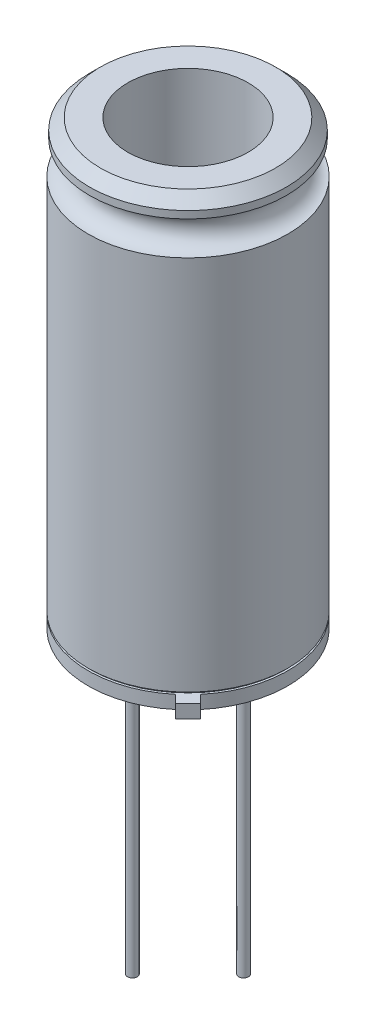
ISO-10303-21;
HEADER;
FILE_DESCRIPTION(('STEP AP214'),'2;1');
FILE_NAME('part.step','',(''),(''),'','','');
FILE_SCHEMA(('AUTOMOTIVE_DESIGN { 1 0 10303 214 1 1 1 1 }'));
ENDSEC;
DATA;
#1=APPLICATION_CONTEXT('core data for automotive mechanical design processes');
#2=APPLICATION_PROTOCOL_DEFINITION('international standard','automotive_design',2000,#1);
#3=PRODUCT_CONTEXT('',#1,'mechanical');
#4=PRODUCT('Part','Part','',(#3));
#5=PRODUCT_RELATED_PRODUCT_CATEGORY('part','',(#4));
#6=PRODUCT_DEFINITION_FORMATION('','',#4);
#7=PRODUCT_DEFINITION_CONTEXT('part definition',#1,'design');
#8=PRODUCT_DEFINITION('design','',#6,#7);
#9=PRODUCT_DEFINITION_SHAPE('','',#8);
#10=(LENGTH_UNIT() NAMED_UNIT(*) SI_UNIT(.MILLI.,.METRE.));
#11=(NAMED_UNIT(*) PLANE_ANGLE_UNIT() SI_UNIT($,.RADIAN.));
#12=(NAMED_UNIT(*) SI_UNIT($,.STERADIAN.) SOLID_ANGLE_UNIT());
#13=UNCERTAINTY_MEASURE_WITH_UNIT(LENGTH_MEASURE(1.E-05),#10,'distance_accuracy_value','');
#14=(GEOMETRIC_REPRESENTATION_CONTEXT(3) GLOBAL_UNCERTAINTY_ASSIGNED_CONTEXT((#13)) GLOBAL_UNIT_ASSIGNED_CONTEXT((#10,
#11,#12)) REPRESENTATION_CONTEXT('',''));
#15=CARTESIAN_POINT('',(0.,0.,0.));
#16=DIRECTION('',(0.,0.,1.));
#17=DIRECTION('',(1.,0.,0.));
#18=AXIS2_PLACEMENT_3D('',#15,#16,#17);
#19=CARTESIAN_POINT('',(-4.46,0.,0.));
#20=DIRECTION('',(0.,1.,0.));
#21=DIRECTION('',(-1.,0.,0.));
#22=AXIS2_PLACEMENT_3D('',#19,#20,#21);
#23=PLANE('',#22);
#24=CARTESIAN_POINT('',(0.,0.,0.));
#25=DIRECTION('',(0.,1.,0.));
#26=DIRECTION('',(-1.,0.,0.));
#27=AXIS2_PLACEMENT_3D('',#24,#25,#26);
#28=CIRCLE('',#27,4.46);
#29=CARTESIAN_POINT('',(-4.46,0.,0.));
#30=VERTEX_POINT('',#29);
#31=EDGE_CURVE('E121',#30,#30,#28,.T.);
#32=ORIENTED_EDGE('',*,*,#31,.T.);
#33=EDGE_LOOP('',(#32));
#34=FACE_BOUND('',#33,.T.);
#35=ADVANCED_FACE('F43',(#34),#23,.T.);
#36=CARTESIAN_POINT('',(0.,-0.699999999999999,0.));
#37=DIRECTION('',(0.,-1.,0.));
#38=DIRECTION('',(1.,0.,0.));
#39=AXIS2_PLACEMENT_3D('',#36,#37,#38);
#40=PLANE('',#39);
#41=CARTESIAN_POINT('',(0.,-0.699999999999999,2.54));
#42=DIRECTION('',(0.,-1.,0.));
#43=DIRECTION('',(1.,0.,0.));
#44=AXIS2_PLACEMENT_3D('',#41,#42,#43);
#45=CIRCLE('',#44,0.225);
#46=CARTESIAN_POINT('',(0.225,-0.699999999999999,2.54));
#47=VERTEX_POINT('',#46);
#48=EDGE_CURVE('E132',#47,#47,#45,.F.);
#49=ORIENTED_EDGE('',*,*,#48,.T.);
#50=EDGE_LOOP('',(#49));
#51=FACE_BOUND('',#50,.T.);
#52=CARTESIAN_POINT('',(-2.54,-0.699999999999999,0.));
#53=DIRECTION('',(0.,-1.,0.));
#54=DIRECTION('',(1.,0.,0.));
#55=AXIS2_PLACEMENT_3D('',#52,#53,#54);
#56=CIRCLE('',#55,0.8);
#57=CARTESIAN_POINT('',(-1.74,-0.699999999999999,0.));
#58=VERTEX_POINT('',#57);
#59=EDGE_CURVE('E135',#58,#58,#56,.T.);
#60=ORIENTED_EDGE('',*,*,#59,.F.);
#61=EDGE_LOOP('',(#60));
#62=FACE_BOUND('',#61,.T.);
#63=CARTESIAN_POINT('',(0.,-0.699999999999999,-2.54));
#64=DIRECTION('',(0.,-1.,0.));
#65=DIRECTION('',(1.,0.,0.));
#66=AXIS2_PLACEMENT_3D('',#63,#64,#65);
#67=CIRCLE('',#66,0.8);
#68=CARTESIAN_POINT('',(0.8,-0.699999999999999,-2.54));
#69=VERTEX_POINT('',#68);
#70=EDGE_CURVE('E153',#69,#69,#67,.T.);
#71=ORIENTED_EDGE('',*,*,#70,.F.);
#72=EDGE_LOOP('',(#71));
#73=FACE_BOUND('',#72,.T.);
#74=CARTESIAN_POINT('',(2.54,-0.699999999999999,0.));
#75=DIRECTION('',(0.,-1.,0.));
#76=DIRECTION('',(1.,0.,0.));
#77=AXIS2_PLACEMENT_3D('',#74,#75,#76);
#78=CIRCLE('',#77,0.8);
#79=CARTESIAN_POINT('',(3.34,-0.699999999999999,0.));
#80=VERTEX_POINT('',#79);
#81=EDGE_CURVE('E109',#80,#80,#78,.T.);
#82=ORIENTED_EDGE('',*,*,#81,.F.);
#83=EDGE_LOOP('',(#82));
#84=FACE_BOUND('',#83,.T.);
#85=DIRECTION('',(-0.707106781186546,0.,-0.707106781186549));
#86=VECTOR('',#85,1.);
#87=CARTESIAN_POINT('',(-0.282842712474619,-0.699999999999999,0.282842712474618));
#88=LINE('',#87,#86);
#89=CARTESIAN_POINT('',(3.2951176003293,-0.699999999999999,3.86080302527856));
#90=VERTEX_POINT('',#89);
#91=CARTESIAN_POINT('',(2.92913487150693,-0.699999999999999,3.49482029645618));
#92=VERTEX_POINT('',#91);
#93=EDGE_CURVE('E90',#90,#92,#88,.T.);
#94=ORIENTED_EDGE('',*,*,#93,.T.);
#95=CARTESIAN_POINT('',(0.,-0.699999999999999,0.));
#96=DIRECTION('',(0.,1.,0.));
#97=DIRECTION('',(-1.,0.,0.));
#98=AXIS2_PLACEMENT_3D('',#95,#96,#97);
#99=CIRCLE('',#98,4.56);
#100=CARTESIAN_POINT('',(3.49482029645617,-0.699999999999999,2.92913487150694));
#101=VERTEX_POINT('',#100);
#102=EDGE_CURVE('E61',#101,#92,#99,.T.);
#103=ORIENTED_EDGE('',*,*,#102,.F.);
#104=DIRECTION('',(0.707106781186546,0.,0.707106781186549));
#105=VECTOR('',#104,1.);
#106=CARTESIAN_POINT('',(0.28284271247462,-0.699999999999999,-0.282842712474618));
#107=LINE('',#106,#105);
#108=CARTESIAN_POINT('',(3.86080302527854,-0.699999999999999,3.29511760032932));
#109=VERTEX_POINT('',#108);
#110=EDGE_CURVE('E81',#101,#109,#107,.T.);
#111=ORIENTED_EDGE('',*,*,#110,.T.);
#112=DIRECTION('',(-0.70710678118655,0.,0.707106781186545));
#113=VECTOR('',#112,1.);
#114=CARTESIAN_POINT('',(3.86080302527854,-0.699999999999999,3.29511760032932));
#115=LINE('',#114,#113);
#116=EDGE_CURVE('E86',#109,#90,#115,.T.);
#117=ORIENTED_EDGE('',*,*,#116,.T.);
#118=EDGE_LOOP('',(#94,#103,#111,#117));
#119=FACE_BOUND('',#118,.T.);
#120=ADVANCED_FACE('F84',(#51,#62,#73,#84,#119),#40,.T.);
#121=CARTESIAN_POINT('',(0.,0.,0.));
#122=DIRECTION('',(0.,1.,0.));
#123=DIRECTION('',(-1.,0.,0.));
#124=AXIS2_PLACEMENT_3D('',#121,#122,#123);
#125=CYLINDRICAL_SURFACE('',#124,4.56);
#126=DIRECTION('',(0.,1.,0.));
#127=VECTOR('',#126,1.);
#128=CARTESIAN_POINT('',(2.92913487150693,0.,3.49482029645618));
#129=LINE('',#128,#127);
#130=CARTESIAN_POINT('',(2.92913487150693,-0.0999999999999991,3.49482029645618));
#131=VERTEX_POINT('',#130);
#132=EDGE_CURVE('E119',#131,#92,#129,.F.);
#133=ORIENTED_EDGE('',*,*,#132,.F.);
#134=CARTESIAN_POINT('',(0.,-0.0999999999999995,0.));
#135=DIRECTION('',(0.,1.,0.));
#136=DIRECTION('',(-1.,0.,0.));
#137=AXIS2_PLACEMENT_3D('',#134,#135,#136);
#138=CIRCLE('',#137,4.56);
#139=CARTESIAN_POINT('',(3.49482029645617,-0.099999999999999,2.92913487150694));
#140=VERTEX_POINT('',#139);
#141=EDGE_CURVE('E127',#140,#131,#138,.T.);
#142=ORIENTED_EDGE('',*,*,#141,.F.);
#143=DIRECTION('',(0.,1.,0.));
#144=VECTOR('',#143,1.);
#145=CARTESIAN_POINT('',(3.49482029645617,0.,2.92913487150694));
#146=LINE('',#145,#144);
#147=EDGE_CURVE('E57',#101,#140,#146,.T.);
#148=ORIENTED_EDGE('',*,*,#147,.F.);
#149=ORIENTED_EDGE('',*,*,#102,.T.);
#150=EDGE_LOOP('',(#133,#142,#148,#149));
#151=FACE_BOUND('',#150,.T.);
#152=ADVANCED_FACE('F207',(#151),#125,.T.);
#153=CARTESIAN_POINT('',(-4.56,-0.1,0.));
#154=DIRECTION('',(0.,1.,0.));
#155=DIRECTION('',(-1.,0.,0.));
#156=AXIS2_PLACEMENT_3D('',#153,#154,#155);
#157=PLANE('',#156);
#158=ORIENTED_EDGE('',*,*,#141,.T.);
#159=DIRECTION('',(-0.707106781186546,0.,-0.707106781186549));
#160=VECTOR('',#159,1.);
#161=CARTESIAN_POINT('',(-0.28284271247462,-0.0999999999999994,0.282842712474618));
#162=LINE('',#161,#160);
#163=CARTESIAN_POINT('',(3.2951176003293,-0.099999999999999,3.86080302527856));
#164=VERTEX_POINT('',#163);
#165=EDGE_CURVE('E89',#164,#131,#162,.T.);
#166=ORIENTED_EDGE('',*,*,#165,.F.);
#167=DIRECTION('',(-0.70710678118655,0.,0.707106781186545));
#168=VECTOR('',#167,1.);
#169=CARTESIAN_POINT('',(3.86080302527854,-0.0999999999999994,3.29511760032932));
#170=LINE('',#169,#168);
#171=CARTESIAN_POINT('',(3.86080302527854,-0.099999999999999,3.29511760032932));
#172=VERTEX_POINT('',#171);
#173=EDGE_CURVE('E100',#172,#164,#170,.T.);
#174=ORIENTED_EDGE('',*,*,#173,.F.);
#175=DIRECTION('',(0.707106781186546,0.,0.707106781186549));
#176=VECTOR('',#175,1.);
#177=CARTESIAN_POINT('',(0.28284271247462,-0.0999999999999994,-0.282842712474618));
#178=LINE('',#177,#176);
#179=EDGE_CURVE('E96',#140,#172,#178,.T.);
#180=ORIENTED_EDGE('',*,*,#179,.F.);
#181=EDGE_LOOP('',(#158,#166,#174,#180));
#182=FACE_BOUND('',#181,.T.);
#183=CARTESIAN_POINT('',(0.,-0.0999999999999995,0.));
#184=DIRECTION('',(0.,1.,0.));
#185=DIRECTION('',(-1.,0.,0.));
#186=AXIS2_PLACEMENT_3D('',#183,#184,#185);
#187=CIRCLE('',#186,4.46);
#188=CARTESIAN_POINT('',(-4.46,-0.1,0.));
#189=VERTEX_POINT('',#188);
#190=EDGE_CURVE('E124',#189,#189,#187,.T.);
#191=ORIENTED_EDGE('',*,*,#190,.F.);
#192=EDGE_LOOP('',(#191));
#193=FACE_BOUND('',#192,.T.);
#194=ADVANCED_FACE('F214',(#182,#193),#157,.T.);
#195=CARTESIAN_POINT('',(0.,0.,0.));
#196=DIRECTION('',(0.,1.,0.));
#197=DIRECTION('',(-1.,0.,0.));
#198=AXIS2_PLACEMENT_3D('',#195,#196,#197);
#199=CYLINDRICAL_SURFACE('',#198,4.46);
#200=ORIENTED_EDGE('',*,*,#190,.T.);
#201=EDGE_LOOP('',(#200));
#202=FACE_BOUND('',#201,.T.);
#203=ORIENTED_EDGE('',*,*,#31,.F.);
#204=EDGE_LOOP('',(#203));
#205=FACE_BOUND('',#204,.T.);
#206=ADVANCED_FACE('F211',(#202,#205),#199,.T.);
#207=CARTESIAN_POINT('',(-0.28284271247462,5.76,0.282842712474618));
#208=DIRECTION('',(-0.707106781186549,0.,0.707106781186546));
#209=DIRECTION('',(0.707106781186546,0.,0.707106781186549));
#210=AXIS2_PLACEMENT_3D('',#207,#208,#209);
#211=PLANE('',#210);
#212=ORIENTED_EDGE('',*,*,#165,.T.);
#213=ORIENTED_EDGE('',*,*,#132,.T.);
#214=ORIENTED_EDGE('',*,*,#93,.F.);
#215=DIRECTION('',(0.,-1.,0.));
#216=VECTOR('',#215,1.);
#217=CARTESIAN_POINT('',(3.2951176003293,5.76,3.86080302527856));
#218=LINE('',#217,#216);
#219=EDGE_CURVE('E104',#164,#90,#218,.T.);
#220=ORIENTED_EDGE('',*,*,#219,.F.);
#221=EDGE_LOOP('',(#212,#213,#214,#220));
#222=FACE_BOUND('',#221,.T.);
#223=ADVANCED_FACE('F213',(#222),#211,.T.);
#224=CARTESIAN_POINT('',(0.282842712474619,5.76,-0.282842712474618));
#225=DIRECTION('',(0.707106781186549,0.,-0.707106781186546));
#226=DIRECTION('',(-0.707106781186546,0.,-0.707106781186549));
#227=AXIS2_PLACEMENT_3D('',#224,#225,#226);
#228=PLANE('',#227);
#229=ORIENTED_EDGE('',*,*,#110,.F.);
#230=ORIENTED_EDGE('',*,*,#147,.T.);
#231=ORIENTED_EDGE('',*,*,#179,.T.);
#232=DIRECTION('',(0.,-1.,0.));
#233=VECTOR('',#232,1.);
#234=CARTESIAN_POINT('',(3.86080302527854,5.76,3.29511760032932));
#235=LINE('',#234,#233);
#236=EDGE_CURVE('E93',#172,#109,#235,.T.);
#237=ORIENTED_EDGE('',*,*,#236,.T.);
#238=EDGE_LOOP('',(#229,#230,#231,#237));
#239=FACE_BOUND('',#238,.T.);
#240=ADVANCED_FACE('F94',(#239),#228,.T.);
#241=CARTESIAN_POINT('',(3.86080302527854,5.76,3.29511760032932));
#242=DIRECTION('',(0.707106781186545,0.,0.70710678118655));
#243=DIRECTION('',(0.70710678118655,0.,-0.707106781186545));
#244=AXIS2_PLACEMENT_3D('',#241,#242,#243);
#245=PLANE('',#244);
#246=ORIENTED_EDGE('',*,*,#236,.F.);
#247=ORIENTED_EDGE('',*,*,#173,.T.);
#248=ORIENTED_EDGE('',*,*,#219,.T.);
#249=ORIENTED_EDGE('',*,*,#116,.F.);
#250=EDGE_LOOP('',(#246,#247,#248,#249));
#251=FACE_BOUND('',#250,.T.);
#252=ADVANCED_FACE('F102',(#251),#245,.T.);
#253=CARTESIAN_POINT('',(-4.56,-0.1,0.));
#254=DIRECTION('',(0.,1.,0.));
#255=DIRECTION('',(-1.,0.,0.));
#256=AXIS2_PLACEMENT_3D('',#253,#254,#255);
#257=PLANE('',#256);
#258=CARTESIAN_POINT('',(2.54,-0.0999999999999977,0.));
#259=DIRECTION('',(0.,1.,0.));
#260=DIRECTION('',(-1.,0.,0.));
#261=AXIS2_PLACEMENT_3D('',#258,#259,#260);
#262=CIRCLE('',#261,0.225);
#263=CARTESIAN_POINT('',(2.315,-0.0999999999999977,0.));
#264=VERTEX_POINT('',#263);
#265=EDGE_CURVE('E131',#264,#264,#262,.F.);
#266=ORIENTED_EDGE('',*,*,#265,.F.);
#267=EDGE_LOOP('',(#266));
#268=FACE_BOUND('',#267,.T.);
#269=CARTESIAN_POINT('',(2.54,-0.099999999999999,0.));
#270=DIRECTION('',(0.,1.,0.));
#271=DIRECTION('',(-1.,0.,0.));
#272=AXIS2_PLACEMENT_3D('',#269,#270,#271);
#273=CIRCLE('',#272,0.8);
#274=CARTESIAN_POINT('',(1.74,-0.0999999999999991,0.));
#275=VERTEX_POINT('',#274);
#276=EDGE_CURVE('E105',#275,#275,#273,.F.);
#277=ORIENTED_EDGE('',*,*,#276,.T.);
#278=EDGE_LOOP('',(#277));
#279=FACE_BOUND('',#278,.T.);
#280=ADVANCED_FACE('F267',(#268,#279),#257,.F.);
#281=CARTESIAN_POINT('',(2.54,2.16274169979695,0.));
#282=DIRECTION('',(0.,-1.,0.));
#283=DIRECTION('',(1.,0.,0.));
#284=AXIS2_PLACEMENT_3D('',#281,#282,#283);
#285=CYLINDRICAL_SURFACE('',#284,0.8);
#286=ORIENTED_EDGE('',*,*,#81,.T.);
#287=EDGE_LOOP('',(#286));
#288=FACE_BOUND('',#287,.T.);
#289=ORIENTED_EDGE('',*,*,#276,.F.);
#290=EDGE_LOOP('',(#289));
#291=FACE_BOUND('',#290,.T.);
#292=ADVANCED_FACE('F147',(#288,#291),#285,.F.);
#293=CARTESIAN_POINT('',(-4.56,-0.1,0.));
#294=DIRECTION('',(0.,1.,0.));
#295=DIRECTION('',(-1.,0.,0.));
#296=AXIS2_PLACEMENT_3D('',#293,#294,#295);
#297=PLANE('',#296);
#298=CARTESIAN_POINT('',(0.,-0.0999999999999994,-2.54));
#299=DIRECTION('',(0.,1.,0.));
#300=DIRECTION('',(-1.,0.,0.));
#301=AXIS2_PLACEMENT_3D('',#298,#299,#300);
#302=CIRCLE('',#301,0.225);
#303=CARTESIAN_POINT('',(-0.225,-0.0999999999999994,-2.54));
#304=VERTEX_POINT('',#303);
#305=EDGE_CURVE('E50',#304,#304,#302,.F.);
#306=ORIENTED_EDGE('',*,*,#305,.F.);
#307=EDGE_LOOP('',(#306));
#308=FACE_BOUND('',#307,.T.);
#309=CARTESIAN_POINT('',(0.,-0.0999999999999994,-2.54));
#310=DIRECTION('',(0.,1.,0.));
#311=DIRECTION('',(-1.,0.,0.));
#312=AXIS2_PLACEMENT_3D('',#309,#310,#311);
#313=CIRCLE('',#312,0.8);
#314=CARTESIAN_POINT('',(-0.8,-0.0999999999999995,-2.54));
#315=VERTEX_POINT('',#314);
#316=EDGE_CURVE('E151',#315,#315,#313,.F.);
#317=ORIENTED_EDGE('',*,*,#316,.T.);
#318=EDGE_LOOP('',(#317));
#319=FACE_BOUND('',#318,.T.);
#320=ADVANCED_FACE('F143',(#308,#319),#297,.F.);
#321=CARTESIAN_POINT('',(0.,2.16274169979695,-2.54));
#322=DIRECTION('',(0.,-1.,0.));
#323=DIRECTION('',(1.,0.,0.));
#324=AXIS2_PLACEMENT_3D('',#321,#322,#323);
#325=CYLINDRICAL_SURFACE('',#324,0.8);
#326=ORIENTED_EDGE('',*,*,#70,.T.);
#327=EDGE_LOOP('',(#326));
#328=FACE_BOUND('',#327,.T.);
#329=ORIENTED_EDGE('',*,*,#316,.F.);
#330=EDGE_LOOP('',(#329));
#331=FACE_BOUND('',#330,.T.);
#332=ADVANCED_FACE('F146',(#328,#331),#325,.F.);
#333=CARTESIAN_POINT('',(-4.56,-0.1,0.));
#334=DIRECTION('',(0.,1.,0.));
#335=DIRECTION('',(-1.,0.,0.));
#336=AXIS2_PLACEMENT_3D('',#333,#334,#335);
#337=PLANE('',#336);
#338=CARTESIAN_POINT('',(-2.54,-0.0999999999999994,0.));
#339=DIRECTION('',(0.,1.,0.));
#340=DIRECTION('',(-1.,0.,0.));
#341=AXIS2_PLACEMENT_3D('',#338,#339,#340);
#342=CIRCLE('',#341,0.225);
#343=CARTESIAN_POINT('',(-2.765,-0.0999999999999994,0.));
#344=VERTEX_POINT('',#343);
#345=EDGE_CURVE('E12',#344,#344,#342,.F.);
#346=ORIENTED_EDGE('',*,*,#345,.F.);
#347=EDGE_LOOP('',(#346));
#348=FACE_BOUND('',#347,.T.);
#349=CARTESIAN_POINT('',(-2.54,-0.0999999999999994,0.));
#350=DIRECTION('',(0.,1.,0.));
#351=DIRECTION('',(-1.,0.,0.));
#352=AXIS2_PLACEMENT_3D('',#349,#350,#351);
#353=CIRCLE('',#352,0.8);
#354=CARTESIAN_POINT('',(-3.34,-0.0999999999999995,0.));
#355=VERTEX_POINT('',#354);
#356=EDGE_CURVE('E157',#355,#355,#353,.F.);
#357=ORIENTED_EDGE('',*,*,#356,.T.);
#358=EDGE_LOOP('',(#357));
#359=FACE_BOUND('',#358,.T.);
#360=ADVANCED_FACE('F185',(#348,#359),#337,.F.);
#361=CARTESIAN_POINT('',(-2.54,2.16274169979695,0.));
#362=DIRECTION('',(0.,-1.,0.));
#363=DIRECTION('',(1.,0.,0.));
#364=AXIS2_PLACEMENT_3D('',#361,#362,#363);
#365=CYLINDRICAL_SURFACE('',#364,0.8);
#366=ORIENTED_EDGE('',*,*,#59,.T.);
#367=EDGE_LOOP('',(#366));
#368=FACE_BOUND('',#367,.T.);
#369=ORIENTED_EDGE('',*,*,#356,.F.);
#370=EDGE_LOOP('',(#369));
#371=FACE_BOUND('',#370,.T.);
#372=ADVANCED_FACE('F188',(#368,#371),#365,.F.);
#373=CARTESIAN_POINT('',(0.,-13.1,2.54));
#374=DIRECTION('',(0.,1.,0.));
#375=DIRECTION('',(-1.,0.,0.));
#376=AXIS2_PLACEMENT_3D('',#373,#374,#375);
#377=CYLINDRICAL_SURFACE('',#376,0.225);
#378=ORIENTED_EDGE('',*,*,#48,.F.);
#379=EDGE_LOOP('',(#378));
#380=FACE_BOUND('',#379,.T.);
#381=CARTESIAN_POINT('',(0.,-13.1,2.54));
#382=DIRECTION('',(0.,-1.,0.));
#383=DIRECTION('',(1.,0.,0.));
#384=AXIS2_PLACEMENT_3D('',#381,#382,#383);
#385=CIRCLE('',#384,0.225);
#386=CARTESIAN_POINT('',(0.225000000000002,-13.1,2.54));
#387=VERTEX_POINT('',#386);
#388=EDGE_CURVE('E136',#387,#387,#385,.T.);
#389=ORIENTED_EDGE('',*,*,#388,.F.);
#390=EDGE_LOOP('',(#389));
#391=FACE_BOUND('',#390,.T.);
#392=ADVANCED_FACE('F193',(#380,#391),#377,.T.);
#393=CARTESIAN_POINT('',(0.,-13.1,2.54));
#394=DIRECTION('',(0.,-1.,0.));
#395=DIRECTION('',(1.,0.,0.));
#396=AXIS2_PLACEMENT_3D('',#393,#394,#395);
#397=PLANE('',#396);
#398=ORIENTED_EDGE('',*,*,#388,.T.);
#399=EDGE_LOOP('',(#398));
#400=FACE_BOUND('',#399,.T.);
#401=ADVANCED_FACE('F199',(#400),#397,.T.);
#402=CARTESIAN_POINT('',(2.54,-13.1,0.));
#403=DIRECTION('',(0.,1.,0.));
#404=DIRECTION('',(-1.,0.,0.));
#405=AXIS2_PLACEMENT_3D('',#402,#403,#404);
#406=CYLINDRICAL_SURFACE('',#405,0.225);
#407=CARTESIAN_POINT('',(2.54,-13.1,0.));
#408=DIRECTION('',(0.,-1.,0.));
#409=DIRECTION('',(1.,0.,0.));
#410=AXIS2_PLACEMENT_3D('',#407,#408,#409);
#411=CIRCLE('',#410,0.225);
#412=CARTESIAN_POINT('',(2.765,-13.1,0.));
#413=VERTEX_POINT('',#412);
#414=EDGE_CURVE('E166',#413,#413,#411,.T.);
#415=ORIENTED_EDGE('',*,*,#414,.F.);
#416=EDGE_LOOP('',(#415));
#417=FACE_BOUND('',#416,.T.);
#418=ORIENTED_EDGE('',*,*,#265,.T.);
#419=EDGE_LOOP('',(#418));
#420=FACE_BOUND('',#419,.T.);
#421=ADVANCED_FACE('F329',(#417,#420),#406,.T.);
#422=CARTESIAN_POINT('',(2.54,-13.1,0.));
#423=DIRECTION('',(0.,-1.,0.));
#424=DIRECTION('',(1.,0.,0.));
#425=AXIS2_PLACEMENT_3D('',#422,#423,#424);
#426=PLANE('',#425);
#427=ORIENTED_EDGE('',*,*,#414,.T.);
#428=EDGE_LOOP('',(#427));
#429=FACE_BOUND('',#428,.T.);
#430=ADVANCED_FACE('F339',(#429),#426,.T.);
#431=CARTESIAN_POINT('',(0.,-13.1,-2.54));
#432=DIRECTION('',(0.,1.,0.));
#433=DIRECTION('',(-1.,0.,0.));
#434=AXIS2_PLACEMENT_3D('',#431,#432,#433);
#435=CYLINDRICAL_SURFACE('',#434,0.225);
#436=CARTESIAN_POINT('',(0.,-13.1,-2.54));
#437=DIRECTION('',(0.,-1.,0.));
#438=DIRECTION('',(1.,0.,0.));
#439=AXIS2_PLACEMENT_3D('',#436,#437,#438);
#440=CIRCLE('',#439,0.225);
#441=CARTESIAN_POINT('',(0.225000000000002,-13.1,-2.54));
#442=VERTEX_POINT('',#441);
#443=EDGE_CURVE('E169',#442,#442,#440,.T.);
#444=ORIENTED_EDGE('',*,*,#443,.F.);
#445=EDGE_LOOP('',(#444));
#446=FACE_BOUND('',#445,.T.);
#447=ORIENTED_EDGE('',*,*,#305,.T.);
#448=EDGE_LOOP('',(#447));
#449=FACE_BOUND('',#448,.T.);
#450=ADVANCED_FACE('F141',(#446,#449),#435,.T.);
#451=CARTESIAN_POINT('',(0.,-13.1,-2.54));
#452=DIRECTION('',(0.,-1.,0.));
#453=DIRECTION('',(1.,0.,0.));
#454=AXIS2_PLACEMENT_3D('',#451,#452,#453);
#455=PLANE('',#454);
#456=ORIENTED_EDGE('',*,*,#443,.T.);
#457=EDGE_LOOP('',(#456));
#458=FACE_BOUND('',#457,.T.);
#459=ADVANCED_FACE('F181',(#458),#455,.T.);
#460=CARTESIAN_POINT('',(-2.54,-13.1,0.));
#461=DIRECTION('',(0.,1.,0.));
#462=DIRECTION('',(-1.,0.,0.));
#463=AXIS2_PLACEMENT_3D('',#460,#461,#462);
#464=CYLINDRICAL_SURFACE('',#463,0.225);
#465=CARTESIAN_POINT('',(-2.54,-13.1,0.));
#466=DIRECTION('',(0.,-1.,0.));
#467=DIRECTION('',(1.,0.,0.));
#468=AXIS2_PLACEMENT_3D('',#465,#466,#467);
#469=CIRCLE('',#468,0.225);
#470=CARTESIAN_POINT('',(-2.315,-13.1,0.));
#471=VERTEX_POINT('',#470);
#472=EDGE_CURVE('E172',#471,#471,#469,.T.);
#473=ORIENTED_EDGE('',*,*,#472,.F.);
#474=EDGE_LOOP('',(#473));
#475=FACE_BOUND('',#474,.T.);
#476=ORIENTED_EDGE('',*,*,#345,.T.);
#477=EDGE_LOOP('',(#476));
#478=FACE_BOUND('',#477,.T.);
#479=ADVANCED_FACE('F178',(#475,#478),#464,.T.);
#480=CARTESIAN_POINT('',(-2.54,-13.1,0.));
#481=DIRECTION('',(0.,-1.,0.));
#482=DIRECTION('',(1.,0.,0.));
#483=AXIS2_PLACEMENT_3D('',#480,#481,#482);
#484=PLANE('',#483);
#485=ORIENTED_EDGE('',*,*,#472,.T.);
#486=EDGE_LOOP('',(#485));
#487=FACE_BOUND('',#486,.T.);
#488=ADVANCED_FACE('F176',(#487),#484,.T.);
#489=CLOSED_SHELL('',(#35,#120,#152,#194,#206,#223,#240,#252,#280,#292,#320,#332,#360,#372,#392,
#401,#421,#430,#450,#459,#479,#488));
#490=MANIFOLD_SOLID_BREP('B2',#489);
#491=CARTESIAN_POINT('',(0.,17.92,0.));
#492=DIRECTION('',(0.,1.,0.));
#493=DIRECTION('',(0.,0.,1.));
#494=AXIS2_PLACEMENT_3D('',#491,#492,#493);
#495=TOROIDAL_SURFACE('',#494,4.56,0.75);
#496=CARTESIAN_POINT('',(0.,18.6675961476626,0.));
#497=DIRECTION('',(0.,-1.,0.));
#498=DIRECTION('',(0.,0.,-1.));
#499=AXIS2_PLACEMENT_3D('',#496,#497,#498);
#500=CIRCLE('',#499,4.5);
#501=CARTESIAN_POINT('',(0.,18.6675961476626,-4.5));
#502=VERTEX_POINT('',#501);
#503=EDGE_CURVE('E434',#502,#502,#500,.T.);
#504=ORIENTED_EDGE('',*,*,#503,.T.);
#505=EDGE_LOOP('',(#504));
#506=FACE_BOUND('',#505,.T.);
#507=CARTESIAN_POINT('',(0.,17.17,0.));
#508=DIRECTION('',(0.,1.,0.));
#509=DIRECTION('',(0.,0.,1.));
#510=AXIS2_PLACEMENT_3D('',#507,#508,#509);
#511=CIRCLE('',#510,4.56);
#512=CARTESIAN_POINT('',(0.,17.17,4.56));
#513=VERTEX_POINT('',#512);
#514=EDGE_CURVE('E431',#513,#513,#511,.F.);
#515=ORIENTED_EDGE('',*,*,#514,.F.);
#516=EDGE_LOOP('',(#515));
#517=FACE_BOUND('',#516,.T.);
#518=ADVANCED_FACE('F416',(#506,#517),#495,.F.);
#519=CARTESIAN_POINT('',(0.,0.,0.));
#520=DIRECTION('',(0.,1.,0.));
#521=DIRECTION('',(0.,0.,1.));
#522=AXIS2_PLACEMENT_3D('',#519,#520,#521);
#523=PLANE('',#522);
#524=CARTESIAN_POINT('',(0.,0.,0.));
#525=DIRECTION('',(0.,1.,0.));
#526=DIRECTION('',(0.,0.,1.));
#527=AXIS2_PLACEMENT_3D('',#524,#525,#526);
#528=CIRCLE('',#527,2.75);
#529=CARTESIAN_POINT('',(0.,0.,2.75));
#530=VERTEX_POINT('',#529);
#531=EDGE_CURVE('E437',#530,#530,#528,.T.);
#532=ORIENTED_EDGE('',*,*,#531,.T.);
#533=EDGE_LOOP('',(#532));
#534=FACE_BOUND('',#533,.T.);
#535=CARTESIAN_POINT('',(0.,0.,0.));
#536=DIRECTION('',(0.,1.,0.));
#537=DIRECTION('',(0.,0.,1.));
#538=AXIS2_PLACEMENT_3D('',#535,#536,#537);
#539=CIRCLE('',#538,4.56);
#540=CARTESIAN_POINT('',(0.,0.,4.56));
#541=VERTEX_POINT('',#540);
#542=EDGE_CURVE('E427',#541,#541,#539,.T.);
#543=ORIENTED_EDGE('',*,*,#542,.F.);
#544=EDGE_LOOP('',(#543));
#545=FACE_BOUND('',#544,.T.);
#546=ADVANCED_FACE('F462',(#534,#545),#523,.F.);
#547=CARTESIAN_POINT('',(0.,19.5,0.));
#548=DIRECTION('',(0.,-1.,0.));
#549=DIRECTION('',(0.,0.,-1.));
#550=AXIS2_PLACEMENT_3D('',#547,#548,#549);
#551=CYLINDRICAL_SURFACE('',#550,4.56);
#552=ORIENTED_EDGE('',*,*,#514,.T.);
#553=EDGE_LOOP('',(#552));
#554=FACE_BOUND('',#553,.T.);
#555=ORIENTED_EDGE('',*,*,#542,.T.);
#556=EDGE_LOOP('',(#555));
#557=FACE_BOUND('',#556,.T.);
#558=ADVANCED_FACE('F457',(#554,#557),#551,.T.);
#559=CARTESIAN_POINT('',(0.,19.5,0.));
#560=DIRECTION('',(0.,1.,0.));
#561=DIRECTION('',(0.,0.,1.));
#562=AXIS2_PLACEMENT_3D('',#559,#560,#561);
#563=CYLINDRICAL_SURFACE('',#562,4.5);
#564=CARTESIAN_POINT('',(0.,19.,0.));
#565=DIRECTION('',(0.,1.,0.));
#566=DIRECTION('',(0.,0.,1.));
#567=AXIS2_PLACEMENT_3D('',#564,#565,#566);
#568=CIRCLE('',#567,4.5);
#569=CARTESIAN_POINT('',(0.,19.,4.5));
#570=VERTEX_POINT('',#569);
#571=EDGE_CURVE('E423',#570,#570,#568,.F.);
#572=ORIENTED_EDGE('',*,*,#571,.T.);
#573=EDGE_LOOP('',(#572));
#574=FACE_BOUND('',#573,.T.);
#575=ORIENTED_EDGE('',*,*,#503,.F.);
#576=EDGE_LOOP('',(#575));
#577=FACE_BOUND('',#576,.T.);
#578=ADVANCED_FACE('F450',(#574,#577),#563,.T.);
#579=CARTESIAN_POINT('',(0.,19.5,0.));
#580=DIRECTION('',(0.,1.,0.));
#581=DIRECTION('',(0.,0.,1.));
#582=AXIS2_PLACEMENT_3D('',#579,#580,#581);
#583=PLANE('',#582);
#584=CARTESIAN_POINT('',(0.,19.5,0.));
#585=DIRECTION('',(0.,1.,0.));
#586=DIRECTION('',(0.,0.,1.));
#587=AXIS2_PLACEMENT_3D('',#584,#585,#586);
#588=CIRCLE('',#587,2.75);
#589=CARTESIAN_POINT('',(0.,19.5,2.75));
#590=VERTEX_POINT('',#589);
#591=EDGE_CURVE('E442',#590,#590,#588,.T.);
#592=ORIENTED_EDGE('',*,*,#591,.F.);
#593=EDGE_LOOP('',(#592));
#594=FACE_BOUND('',#593,.T.);
#595=CARTESIAN_POINT('',(0.,19.5,0.));
#596=DIRECTION('',(0.,1.,0.));
#597=DIRECTION('',(0.,0.,1.));
#598=AXIS2_PLACEMENT_3D('',#595,#596,#597);
#599=CIRCLE('',#598,4.);
#600=CARTESIAN_POINT('',(0.,19.5,4.));
#601=VERTEX_POINT('',#600);
#602=EDGE_CURVE('E42',#601,#601,#599,.T.);
#603=ORIENTED_EDGE('',*,*,#602,.T.);
#604=EDGE_LOOP('',(#603));
#605=FACE_BOUND('',#604,.T.);
#606=ADVANCED_FACE('F448',(#594,#605),#583,.T.);
#607=CARTESIAN_POINT('',(0.,19.,0.));
#608=DIRECTION('',(0.,-1.,0.));
#609=DIRECTION('',(0.,0.,-1.));
#610=AXIS2_PLACEMENT_3D('',#607,#608,#609);
#611=CONICAL_SURFACE('',#610,4.5,0.785398163397453);
#612=ORIENTED_EDGE('',*,*,#602,.F.);
#613=EDGE_LOOP('',(#612));
#614=FACE_BOUND('',#613,.T.);
#615=ORIENTED_EDGE('',*,*,#571,.F.);
#616=EDGE_LOOP('',(#615));
#617=FACE_BOUND('',#616,.T.);
#618=ADVANCED_FACE('F418',(#614,#617),#611,.T.);
#619=CARTESIAN_POINT('',(0.,19.5,0.));
#620=DIRECTION('',(0.,1.,0.));
#621=DIRECTION('',(0.,0.,1.));
#622=AXIS2_PLACEMENT_3D('',#619,#620,#621);
#623=CYLINDRICAL_SURFACE('',#622,2.75);
#624=ORIENTED_EDGE('',*,*,#531,.F.);
#625=EDGE_LOOP('',(#624));
#626=FACE_BOUND('',#625,.T.);
#627=ORIENTED_EDGE('',*,*,#591,.T.);
#628=EDGE_LOOP('',(#627));
#629=FACE_BOUND('',#628,.T.);
#630=ADVANCED_FACE('F446',(#626,#629),#623,.F.);
#631=CLOSED_SHELL('',(#518,#546,#558,#578,#606,#618,#630));
#632=MANIFOLD_SOLID_BREP('B6',#631);
#633=ADVANCED_BREP_SHAPE_REPRESENTATION('',(#18,#490,#632),#14);
#634=SHAPE_DEFINITION_REPRESENTATION(#9,#633);
ENDSEC;
END-ISO-10303-21;
